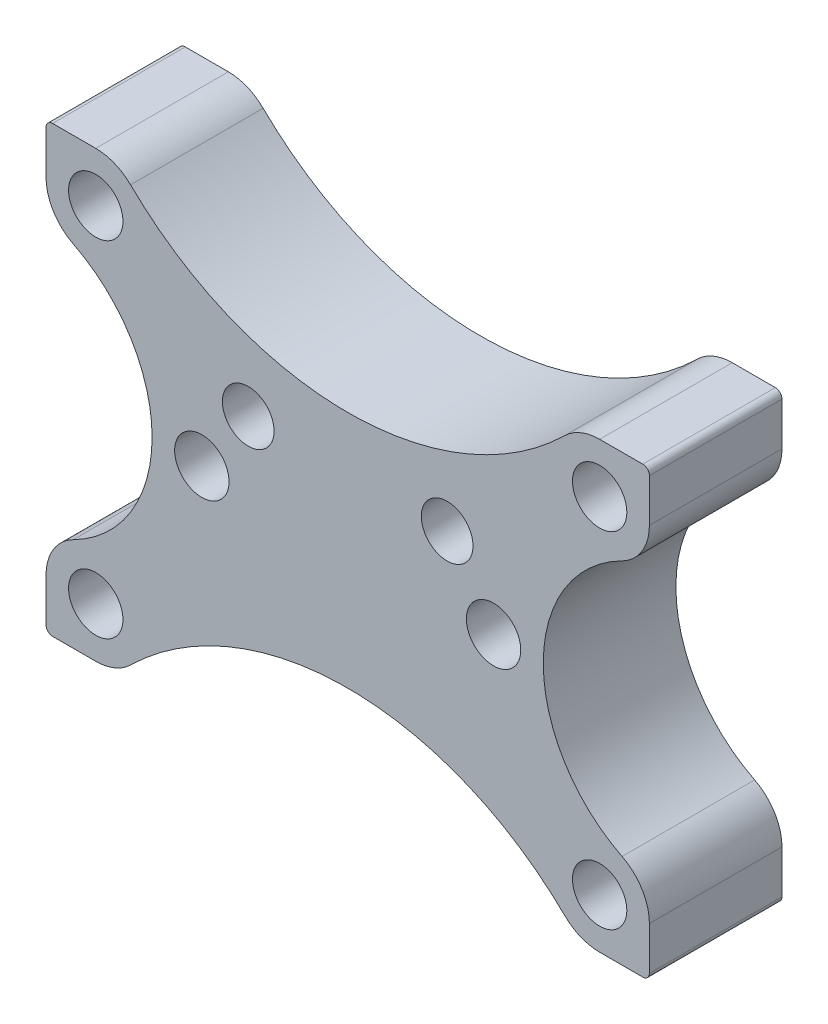
ISO-10303-21;
HEADER;
FILE_DESCRIPTION(('STEP AP214'),'2;1');
FILE_NAME('part.step','',(''),(''),'','','');
FILE_SCHEMA(('AUTOMOTIVE_DESIGN { 1 0 10303 214 1 1 1 1 }'));
ENDSEC;
DATA;
#1=APPLICATION_CONTEXT('core data for automotive mechanical design processes');
#2=APPLICATION_PROTOCOL_DEFINITION('international standard','automotive_design',2000,#1);
#3=PRODUCT_CONTEXT('',#1,'mechanical');
#4=PRODUCT('Part','Part','',(#3));
#5=PRODUCT_RELATED_PRODUCT_CATEGORY('part','',(#4));
#6=PRODUCT_DEFINITION_FORMATION('','',#4);
#7=PRODUCT_DEFINITION_CONTEXT('part definition',#1,'design');
#8=PRODUCT_DEFINITION('design','',#6,#7);
#9=PRODUCT_DEFINITION_SHAPE('','',#8);
#10=(LENGTH_UNIT() NAMED_UNIT(*) SI_UNIT(.MILLI.,.METRE.));
#11=(NAMED_UNIT(*) PLANE_ANGLE_UNIT() SI_UNIT($,.RADIAN.));
#12=(NAMED_UNIT(*) SI_UNIT($,.STERADIAN.) SOLID_ANGLE_UNIT());
#13=UNCERTAINTY_MEASURE_WITH_UNIT(LENGTH_MEASURE(1.E-05),#10,'distance_accuracy_value','');
#14=(GEOMETRIC_REPRESENTATION_CONTEXT(3) GLOBAL_UNCERTAINTY_ASSIGNED_CONTEXT((#13)) GLOBAL_UNIT_ASSIGNED_CONTEXT((#10,
#11,#12)) REPRESENTATION_CONTEXT('',''));
#15=CARTESIAN_POINT('',(0.,0.,0.));
#16=DIRECTION('',(0.,0.,1.));
#17=DIRECTION('',(1.,0.,0.));
#18=AXIS2_PLACEMENT_3D('',#15,#16,#17);
#19=CARTESIAN_POINT('',(-19.0000000000033,13.,10.));
#20=DIRECTION('',(0.,0.,1.));
#21=DIRECTION('',(1.,0.,0.));
#22=AXIS2_PLACEMENT_3D('',#19,#20,#21);
#23=PLANE('',#22);
#24=CARTESIAN_POINT('',(7.5,5.,10.));
#25=DIRECTION('',(0.,0.,1.));
#26=DIRECTION('',(-1.,0.,0.));
#27=AXIS2_PLACEMENT_3D('',#24,#25,#26);
#28=CIRCLE('',#27,1.95);
#29=CARTESIAN_POINT('',(5.55,5.,10.));
#30=VERTEX_POINT('',#29);
#31=EDGE_CURVE('E772',#30,#30,#28,.T.);
#32=ORIENTED_EDGE('',*,*,#31,.F.);
#33=EDGE_LOOP('',(#32));
#34=FACE_BOUND('',#33,.T.);
#35=CARTESIAN_POINT('',(-11.,-1.11195774810113E-12,10.));
#36=DIRECTION('',(0.,0.,1.));
#37=DIRECTION('',(1.,0.,0.));
#38=AXIS2_PLACEMENT_3D('',#35,#36,#37);
#39=CIRCLE('',#38,2.05);
#40=CARTESIAN_POINT('',(-8.95,-1.11195774810113E-12,10.));
#41=VERTEX_POINT('',#40);
#42=EDGE_CURVE('E784',#41,#41,#39,.T.);
#43=ORIENTED_EDGE('',*,*,#42,.F.);
#44=EDGE_LOOP('',(#43));
#45=FACE_BOUND('',#44,.T.);
#46=CARTESIAN_POINT('',(-19.0000000000033,-13.,10.));
#47=DIRECTION('',(0.,0.,1.));
#48=DIRECTION('',(1.,0.,0.));
#49=AXIS2_PLACEMENT_3D('',#46,#47,#48);
#50=CIRCLE('',#49,2.05);
#51=CARTESIAN_POINT('',(-16.9500000000033,-13.,10.));
#52=VERTEX_POINT('',#51);
#53=EDGE_CURVE('E796',#52,#52,#50,.T.);
#54=ORIENTED_EDGE('',*,*,#53,.F.);
#55=EDGE_LOOP('',(#54));
#56=FACE_BOUND('',#55,.T.);
#57=CARTESIAN_POINT('',(18.9999999999967,13.,10.));
#58=DIRECTION('',(0.,0.,1.));
#59=DIRECTION('',(1.,0.,0.));
#60=AXIS2_PLACEMENT_3D('',#57,#58,#59);
#61=CIRCLE('',#60,2.05);
#62=CARTESIAN_POINT('',(21.0499999999967,13.,10.));
#63=VERTEX_POINT('',#62);
#64=EDGE_CURVE('E395',#63,#63,#61,.T.);
#65=ORIENTED_EDGE('',*,*,#64,.F.);
#66=EDGE_LOOP('',(#65));
#67=FACE_BOUND('',#66,.T.);
#68=DIRECTION('',(9.92724421185655E-13,-1.,0.));
#69=VECTOR('',#68,1.);
#70=CARTESIAN_POINT('',(-22.7500000000037,-13.,10.));
#71=LINE('',#70,#69);
#72=CARTESIAN_POINT('',(-22.7500000000028,-13.,10.));
#73=VERTEX_POINT('',#72);
#74=CARTESIAN_POINT('',(-22.7500000000005,-16.2500000000006,10.));
#75=VERTEX_POINT('',#74);
#76=EDGE_CURVE('E409',#73,#75,#71,.T.);
#77=ORIENTED_EDGE('',*,*,#76,.T.);
#78=CARTESIAN_POINT('',(-22.2500000000005,-16.2500000000001,10.));
#79=DIRECTION('',(0.,0.,1.));
#80=DIRECTION('',(1.,0.,0.));
#81=AXIS2_PLACEMENT_3D('',#78,#79,#80);
#82=CIRCLE('',#81,0.5);
#83=CARTESIAN_POINT('',(-22.2500000000005,-16.7500000000001,10.));
#84=VERTEX_POINT('',#83);
#85=EDGE_CURVE('E245',#75,#84,#82,.T.);
#86=ORIENTED_EDGE('',*,*,#85,.T.);
#87=DIRECTION('',(1.,-1.10097116608759E-13,0.));
#88=VECTOR('',#87,1.);
#89=CARTESIAN_POINT('',(-22.75,-16.75,10.));
#90=LINE('',#89,#88);
#91=CARTESIAN_POINT('',(-19.0000000000033,-16.7500000000004,10.));
#92=VERTEX_POINT('',#91);
#93=EDGE_CURVE('E411',#84,#92,#90,.T.);
#94=ORIENTED_EDGE('',*,*,#93,.T.);
#95=CARTESIAN_POINT('',(-19.0000000000033,-13.,10.));
#96=DIRECTION('',(0.,0.,1.));
#97=DIRECTION('',(-1.,0.,0.));
#98=AXIS2_PLACEMENT_3D('',#95,#96,#97);
#99=CIRCLE('',#98,3.75000000000136);
#100=CARTESIAN_POINT('',(-16.3771708475589,-15.6801617930823,10.));
#101=VERTEX_POINT('',#100);
#102=EDGE_CURVE('E413',#92,#101,#99,.T.);
#103=ORIENTED_EDGE('',*,*,#102,.T.);
#104=CARTESIAN_POINT('',(0.,-32.4153225806451,10.));
#105=DIRECTION('',(0.,0.,-1.));
#106=DIRECTION('',(-1.,0.,0.));
#107=AXIS2_PLACEMENT_3D('',#104,#105,#106);
#108=CIRCLE('',#107,23.4153225806451);
#109=CARTESIAN_POINT('',(16.3771708475583,-15.680161793083,10.));
#110=VERTEX_POINT('',#109);
#111=EDGE_CURVE('E377',#101,#110,#108,.T.);
#112=ORIENTED_EDGE('',*,*,#111,.T.);
#113=CARTESIAN_POINT('',(18.9999999999967,-13.,10.));
#114=DIRECTION('',(0.,0.,1.));
#115=DIRECTION('',(-1.,0.,0.));
#116=AXIS2_PLACEMENT_3D('',#113,#114,#115);
#117=CIRCLE('',#116,3.74999999999884);
#118=CARTESIAN_POINT('',(19.,-16.7499999999989,10.));
#119=VERTEX_POINT('',#118);
#120=EDGE_CURVE('E373',#110,#119,#117,.T.);
#121=ORIENTED_EDGE('',*,*,#120,.T.);
#122=DIRECTION('',(1.,0.,0.));
#123=VECTOR('',#122,1.);
#124=CARTESIAN_POINT('',(19.,-16.75,10.));
#125=LINE('',#124,#123);
#126=CARTESIAN_POINT('',(22.2499999999995,-16.75,10.));
#127=VERTEX_POINT('',#126);
#128=EDGE_CURVE('E372',#119,#127,#125,.T.);
#129=ORIENTED_EDGE('',*,*,#128,.T.);
#130=CARTESIAN_POINT('',(22.2499999999995,-16.25,10.));
#131=DIRECTION('',(0.,0.,1.));
#132=DIRECTION('',(1.,0.,0.));
#133=AXIS2_PLACEMENT_3D('',#130,#131,#132);
#134=CIRCLE('',#133,0.5);
#135=CARTESIAN_POINT('',(22.7499999999995,-16.2499999999995,10.));
#136=VERTEX_POINT('',#135);
#137=EDGE_CURVE('E240',#127,#136,#134,.T.);
#138=ORIENTED_EDGE('',*,*,#137,.T.);
#139=DIRECTION('',(-9.90874049477953E-13,1.,0.));
#140=VECTOR('',#139,1.);
#141=CARTESIAN_POINT('',(22.75,-16.75,10.));
#142=LINE('',#141,#140);
#143=CARTESIAN_POINT('',(22.7499999999963,-13.,10.));
#144=VERTEX_POINT('',#143);
#145=EDGE_CURVE('E263',#136,#144,#142,.T.);
#146=ORIENTED_EDGE('',*,*,#145,.T.);
#147=CARTESIAN_POINT('',(18.9999999999967,-13.,10.));
#148=DIRECTION('',(0.,0.,1.));
#149=DIRECTION('',(-1.,0.,0.));
#150=AXIS2_PLACEMENT_3D('',#147,#148,#149);
#151=CIRCLE('',#150,3.75000000000054);
#152=CARTESIAN_POINT('',(20.6899141630897,-9.65236051502232,10.));
#153=VERTEX_POINT('',#152);
#154=EDGE_CURVE('E375',#144,#153,#151,.T.);
#155=ORIENTED_EDGE('',*,*,#154,.T.);
#156=CARTESIAN_POINT('',(25.5625,0.,10.));
#157=DIRECTION('',(0.,0.,-1.));
#158=DIRECTION('',(-1.,0.,0.));
#159=AXIS2_PLACEMENT_3D('',#156,#157,#158);
#160=CIRCLE('',#159,10.8125);
#161=CARTESIAN_POINT('',(20.6899141630901,9.65236051502147,10.));
#162=VERTEX_POINT('',#161);
#163=EDGE_CURVE('E382',#153,#162,#160,.T.);
#164=ORIENTED_EDGE('',*,*,#163,.T.);
#165=CARTESIAN_POINT('',(18.9999999999967,13.,10.));
#166=DIRECTION('',(0.,0.,1.));
#167=DIRECTION('',(1.,0.,0.));
#168=AXIS2_PLACEMENT_3D('',#165,#166,#167);
#169=CIRCLE('',#168,3.75000000000054);
#170=CARTESIAN_POINT('',(22.7499999999972,13.,10.));
#171=VERTEX_POINT('',#170);
#172=EDGE_CURVE('E384',#162,#171,#169,.T.);
#173=ORIENTED_EDGE('',*,*,#172,.T.);
#174=DIRECTION('',(9.899488636241E-13,1.,0.));
#175=VECTOR('',#174,1.);
#176=CARTESIAN_POINT('',(22.75,16.75,10.));
#177=LINE('',#176,#175);
#178=CARTESIAN_POINT('',(22.7499999999995,16.2499999999995,10.));
#179=VERTEX_POINT('',#178);
#180=EDGE_CURVE('E386',#171,#179,#177,.T.);
#181=ORIENTED_EDGE('',*,*,#180,.T.);
#182=CARTESIAN_POINT('',(22.2499999999995,16.25,10.));
#183=DIRECTION('',(0.,0.,1.));
#184=DIRECTION('',(1.,0.,0.));
#185=AXIS2_PLACEMENT_3D('',#182,#183,#184);
#186=CIRCLE('',#185,0.5);
#187=CARTESIAN_POINT('',(22.2499999999994,16.75,10.));
#188=VERTEX_POINT('',#187);
#189=EDGE_CURVE('E47',#179,#188,#186,.T.);
#190=ORIENTED_EDGE('',*,*,#189,.T.);
#191=DIRECTION('',(-1.,-1.08246744900857E-13,0.));
#192=VECTOR('',#191,1.);
#193=CARTESIAN_POINT('',(18.9999999999967,16.7499999999996,10.));
#194=LINE('',#193,#192);
#195=CARTESIAN_POINT('',(18.9999999999967,16.7499999999996,10.));
#196=VERTEX_POINT('',#195);
#197=EDGE_CURVE('E388',#188,#196,#194,.T.);
#198=ORIENTED_EDGE('',*,*,#197,.T.);
#199=CARTESIAN_POINT('',(18.9999999999967,13.,10.));
#200=DIRECTION('',(0.,0.,1.));
#201=DIRECTION('',(1.,0.,0.));
#202=AXIS2_PLACEMENT_3D('',#199,#200,#201);
#203=CIRCLE('',#202,3.74999999999864);
#204=CARTESIAN_POINT('',(16.3771708475576,15.6801617930837,10.));
#205=VERTEX_POINT('',#204);
#206=EDGE_CURVE('E390',#196,#205,#203,.T.);
#207=ORIENTED_EDGE('',*,*,#206,.T.);
#208=CARTESIAN_POINT('',(0.,32.4153225806451,10.));
#209=DIRECTION('',(0.,0.,-1.));
#210=DIRECTION('',(-1.,0.,0.));
#211=AXIS2_PLACEMENT_3D('',#208,#209,#210);
#212=CIRCLE('',#211,23.4153225806451);
#213=CARTESIAN_POINT('',(-16.3771708475583,15.680161793083,10.));
#214=VERTEX_POINT('',#213);
#215=EDGE_CURVE('E211',#205,#214,#212,.T.);
#216=ORIENTED_EDGE('',*,*,#215,.T.);
#217=CARTESIAN_POINT('',(-19.0000000000033,13.,10.));
#218=DIRECTION('',(0.,0.,1.));
#219=DIRECTION('',(1.,0.,0.));
#220=AXIS2_PLACEMENT_3D('',#217,#218,#219);
#221=CIRCLE('',#220,3.75000000000136);
#222=CARTESIAN_POINT('',(-19.0000000000033,16.7500000000004,10.));
#223=VERTEX_POINT('',#222);
#224=EDGE_CURVE('E205',#214,#223,#221,.T.);
#225=ORIENTED_EDGE('',*,*,#224,.T.);
#226=DIRECTION('',(-1.,-1.12872674170324E-13,0.));
#227=VECTOR('',#226,1.);
#228=CARTESIAN_POINT('',(-19.0000000000033,16.7500000000004,10.));
#229=LINE('',#228,#227);
#230=CARTESIAN_POINT('',(-22.2500000000005,16.7500000000001,10.));
#231=VERTEX_POINT('',#230);
#232=EDGE_CURVE('E194',#223,#231,#229,.T.);
#233=ORIENTED_EDGE('',*,*,#232,.T.);
#234=CARTESIAN_POINT('',(-22.2500000000005,16.2500000000001,10.));
#235=DIRECTION('',(0.,0.,1.));
#236=DIRECTION('',(1.,0.,0.));
#237=AXIS2_PLACEMENT_3D('',#234,#235,#236);
#238=CIRCLE('',#237,0.5);
#239=CARTESIAN_POINT('',(-22.7500000000005,16.2500000000005,10.));
#240=VERTEX_POINT('',#239);
#241=EDGE_CURVE('E243',#231,#240,#238,.T.);
#242=ORIENTED_EDGE('',*,*,#241,.T.);
#243=DIRECTION('',(-9.92724421185658E-13,-1.,0.));
#244=VECTOR('',#243,1.);
#245=CARTESIAN_POINT('',(-22.75,16.75,10.));
#246=LINE('',#245,#244);
#247=CARTESIAN_POINT('',(-22.7500000000037,13.,10.));
#248=VERTEX_POINT('',#247);
#249=EDGE_CURVE('E204',#240,#248,#246,.T.);
#250=ORIENTED_EDGE('',*,*,#249,.T.);
#251=CARTESIAN_POINT('',(-19.0000000000033,13.,10.));
#252=DIRECTION('',(0.,0.,1.));
#253=DIRECTION('',(1.,0.,0.));
#254=AXIS2_PLACEMENT_3D('',#251,#252,#253);
#255=CIRCLE('',#254,3.74999999999946);
#256=CARTESIAN_POINT('',(-20.6899141630906,9.65236051502062,10.));
#257=VERTEX_POINT('',#256);
#258=EDGE_CURVE('E402',#248,#257,#255,.T.);
#259=ORIENTED_EDGE('',*,*,#258,.T.);
#260=CARTESIAN_POINT('',(-25.5625,0.,10.));
#261=DIRECTION('',(0.,0.,-1.));
#262=DIRECTION('',(-1.,0.,0.));
#263=AXIS2_PLACEMENT_3D('',#260,#261,#262);
#264=CIRCLE('',#263,10.8125);
#265=CARTESIAN_POINT('',(-20.6899141630901,-9.65236051502147,10.));
#266=VERTEX_POINT('',#265);
#267=EDGE_CURVE('E337',#257,#266,#264,.T.);
#268=ORIENTED_EDGE('',*,*,#267,.T.);
#269=CARTESIAN_POINT('',(-19.0000000000033,-13.,10.));
#270=DIRECTION('',(0.,0.,1.));
#271=DIRECTION('',(-1.,0.,0.));
#272=AXIS2_PLACEMENT_3D('',#269,#270,#271);
#273=CIRCLE('',#272,3.74999999999946);
#274=EDGE_CURVE('E404',#266,#73,#273,.T.);
#275=ORIENTED_EDGE('',*,*,#274,.T.);
#276=EDGE_LOOP('',(#77,#86,#94,#103,#112,#121,#129,#138,#146,#155,#164,#173,#181,#190,#198,#207,
#216,#225,#233,#242,#250,#259,#268,#275));
#277=FACE_BOUND('',#276,.T.);
#278=CARTESIAN_POINT('',(-19.0000000000033,13.,10.));
#279=DIRECTION('',(0.,0.,1.));
#280=DIRECTION('',(1.,0.,0.));
#281=AXIS2_PLACEMENT_3D('',#278,#279,#280);
#282=CIRCLE('',#281,2.05);
#283=CARTESIAN_POINT('',(-16.9500000000033,13.,10.));
#284=VERTEX_POINT('',#283);
#285=EDGE_CURVE('E802',#284,#284,#282,.T.);
#286=ORIENTED_EDGE('',*,*,#285,.F.);
#287=EDGE_LOOP('',(#286));
#288=FACE_BOUND('',#287,.T.);
#289=CARTESIAN_POINT('',(18.9999999999967,-13.,10.));
#290=DIRECTION('',(0.,0.,1.));
#291=DIRECTION('',(1.,0.,0.));
#292=AXIS2_PLACEMENT_3D('',#289,#290,#291);
#293=CIRCLE('',#292,2.05);
#294=CARTESIAN_POINT('',(21.0499999999967,-13.,10.));
#295=VERTEX_POINT('',#294);
#296=EDGE_CURVE('E790',#295,#295,#293,.T.);
#297=ORIENTED_EDGE('',*,*,#296,.F.);
#298=EDGE_LOOP('',(#297));
#299=FACE_BOUND('',#298,.T.);
#300=CARTESIAN_POINT('',(11.,-1.11022302462516E-12,10.));
#301=DIRECTION('',(0.,0.,1.));
#302=DIRECTION('',(1.,0.,0.));
#303=AXIS2_PLACEMENT_3D('',#300,#301,#302);
#304=CIRCLE('',#303,2.05);
#305=CARTESIAN_POINT('',(13.05,-1.11022302462516E-12,10.));
#306=VERTEX_POINT('',#305);
#307=EDGE_CURVE('E778',#306,#306,#304,.T.);
#308=ORIENTED_EDGE('',*,*,#307,.F.);
#309=EDGE_LOOP('',(#308));
#310=FACE_BOUND('',#309,.T.);
#311=CARTESIAN_POINT('',(-7.5,5.,10.));
#312=DIRECTION('',(0.,0.,1.));
#313=DIRECTION('',(-1.,0.,0.));
#314=AXIS2_PLACEMENT_3D('',#311,#312,#313);
#315=CIRCLE('',#314,1.95);
#316=CARTESIAN_POINT('',(-9.45,5.,10.));
#317=VERTEX_POINT('',#316);
#318=EDGE_CURVE('E763',#317,#317,#315,.T.);
#319=ORIENTED_EDGE('',*,*,#318,.F.);
#320=EDGE_LOOP('',(#319));
#321=FACE_BOUND('',#320,.T.);
#322=ADVANCED_FACE('F32',(#34,#45,#56,#67,#277,#288,#299,#310,#321),#23,.T.);
#323=CARTESIAN_POINT('',(-19.0000000000033,13.,0.));
#324=DIRECTION('',(0.,0.,1.));
#325=DIRECTION('',(1.,0.,0.));
#326=AXIS2_PLACEMENT_3D('',#323,#324,#325);
#327=PLANE('',#326);
#328=CARTESIAN_POINT('',(7.5,5.,0.));
#329=DIRECTION('',(0.,0.,1.));
#330=DIRECTION('',(-1.,0.,0.));
#331=AXIS2_PLACEMENT_3D('',#328,#329,#330);
#332=CIRCLE('',#331,1.95);
#333=CARTESIAN_POINT('',(5.55,5.,0.));
#334=VERTEX_POINT('',#333);
#335=EDGE_CURVE('E769',#334,#334,#332,.T.);
#336=ORIENTED_EDGE('',*,*,#335,.T.);
#337=EDGE_LOOP('',(#336));
#338=FACE_BOUND('',#337,.T.);
#339=CARTESIAN_POINT('',(-11.,-1.11195774810113E-12,0.));
#340=DIRECTION('',(0.,0.,1.));
#341=DIRECTION('',(1.,0.,0.));
#342=AXIS2_PLACEMENT_3D('',#339,#340,#341);
#343=CIRCLE('',#342,2.05);
#344=CARTESIAN_POINT('',(-8.95,-1.11195774810113E-12,0.));
#345=VERTEX_POINT('',#344);
#346=EDGE_CURVE('E781',#345,#345,#343,.T.);
#347=ORIENTED_EDGE('',*,*,#346,.T.);
#348=EDGE_LOOP('',(#347));
#349=FACE_BOUND('',#348,.T.);
#350=CARTESIAN_POINT('',(-19.0000000000033,-13.,0.));
#351=DIRECTION('',(0.,0.,1.));
#352=DIRECTION('',(1.,0.,0.));
#353=AXIS2_PLACEMENT_3D('',#350,#351,#352);
#354=CIRCLE('',#353,2.05);
#355=CARTESIAN_POINT('',(-16.9500000000033,-13.,0.));
#356=VERTEX_POINT('',#355);
#357=EDGE_CURVE('E793',#356,#356,#354,.T.);
#358=ORIENTED_EDGE('',*,*,#357,.T.);
#359=EDGE_LOOP('',(#358));
#360=FACE_BOUND('',#359,.T.);
#361=CARTESIAN_POINT('',(18.9999999999967,13.,0.));
#362=DIRECTION('',(0.,0.,1.));
#363=DIRECTION('',(1.,0.,0.));
#364=AXIS2_PLACEMENT_3D('',#361,#362,#363);
#365=CIRCLE('',#364,2.05);
#366=CARTESIAN_POINT('',(21.0499999999967,13.,0.));
#367=VERTEX_POINT('',#366);
#368=EDGE_CURVE('E805',#367,#367,#365,.T.);
#369=ORIENTED_EDGE('',*,*,#368,.T.);
#370=EDGE_LOOP('',(#369));
#371=FACE_BOUND('',#370,.T.);
#372=DIRECTION('',(1.,-1.10097116608759E-13,0.));
#373=VECTOR('',#372,1.);
#374=CARTESIAN_POINT('',(-22.75,-16.75,0.));
#375=LINE('',#374,#373);
#376=CARTESIAN_POINT('',(-22.2500000000005,-16.7500000000001,0.));
#377=VERTEX_POINT('',#376);
#378=CARTESIAN_POINT('',(-19.0000000000033,-16.7500000000004,0.));
#379=VERTEX_POINT('',#378);
#380=EDGE_CURVE('E355',#377,#379,#375,.T.);
#381=ORIENTED_EDGE('',*,*,#380,.F.);
#382=CARTESIAN_POINT('',(-22.2500000000005,-16.2500000000001,0.));
#383=DIRECTION('',(0.,0.,1.));
#384=DIRECTION('',(1.,0.,0.));
#385=AXIS2_PLACEMENT_3D('',#382,#383,#384);
#386=CIRCLE('',#385,0.5);
#387=CARTESIAN_POINT('',(-22.7500000000005,-16.2500000000006,0.));
#388=VERTEX_POINT('',#387);
#389=EDGE_CURVE('E236',#377,#388,#386,.F.);
#390=ORIENTED_EDGE('',*,*,#389,.T.);
#391=DIRECTION('',(9.92724421185655E-13,-1.,0.));
#392=VECTOR('',#391,1.);
#393=CARTESIAN_POINT('',(-22.7500000000037,-13.,0.));
#394=LINE('',#393,#392);
#395=CARTESIAN_POINT('',(-22.7500000000028,-13.,0.));
#396=VERTEX_POINT('',#395);
#397=EDGE_CURVE('E347',#396,#388,#394,.T.);
#398=ORIENTED_EDGE('',*,*,#397,.F.);
#399=CARTESIAN_POINT('',(-19.0000000000033,-13.,0.));
#400=DIRECTION('',(0.,0.,1.));
#401=DIRECTION('',(-1.,0.,0.));
#402=AXIS2_PLACEMENT_3D('',#399,#400,#401);
#403=CIRCLE('',#402,3.74999999999946);
#404=CARTESIAN_POINT('',(-20.6899141630901,-9.65236051502147,0.));
#405=VERTEX_POINT('',#404);
#406=EDGE_CURVE('E345',#405,#396,#403,.T.);
#407=ORIENTED_EDGE('',*,*,#406,.F.);
#408=CARTESIAN_POINT('',(-25.5625,0.,0.));
#409=DIRECTION('',(0.,0.,-1.));
#410=DIRECTION('',(-1.,0.,0.));
#411=AXIS2_PLACEMENT_3D('',#408,#409,#410);
#412=CIRCLE('',#411,10.8125);
#413=CARTESIAN_POINT('',(-20.6899141630906,9.65236051502062,0.));
#414=VERTEX_POINT('',#413);
#415=EDGE_CURVE('E336',#414,#405,#412,.T.);
#416=ORIENTED_EDGE('',*,*,#415,.F.);
#417=CARTESIAN_POINT('',(-19.0000000000033,13.,0.));
#418=DIRECTION('',(0.,0.,1.));
#419=DIRECTION('',(1.,0.,0.));
#420=AXIS2_PLACEMENT_3D('',#417,#418,#419);
#421=CIRCLE('',#420,3.74999999999946);
#422=CARTESIAN_POINT('',(-22.7500000000037,13.,0.));
#423=VERTEX_POINT('',#422);
#424=EDGE_CURVE('E343',#423,#414,#421,.T.);
#425=ORIENTED_EDGE('',*,*,#424,.F.);
#426=DIRECTION('',(-9.92724421185658E-13,-1.,0.));
#427=VECTOR('',#426,1.);
#428=CARTESIAN_POINT('',(-22.75,16.75,0.));
#429=LINE('',#428,#427);
#430=CARTESIAN_POINT('',(-22.7500000000005,16.2500000000005,0.));
#431=VERTEX_POINT('',#430);
#432=EDGE_CURVE('E349',#431,#423,#429,.T.);
#433=ORIENTED_EDGE('',*,*,#432,.F.);
#434=CARTESIAN_POINT('',(-22.2500000000005,16.2500000000001,0.));
#435=DIRECTION('',(0.,0.,1.));
#436=DIRECTION('',(1.,0.,0.));
#437=AXIS2_PLACEMENT_3D('',#434,#435,#436);
#438=CIRCLE('',#437,0.5);
#439=CARTESIAN_POINT('',(-22.2500000000005,16.7500000000001,0.));
#440=VERTEX_POINT('',#439);
#441=EDGE_CURVE('E234',#431,#440,#438,.F.);
#442=ORIENTED_EDGE('',*,*,#441,.T.);
#443=DIRECTION('',(-1.,-1.12872674170324E-13,0.));
#444=VECTOR('',#443,1.);
#445=CARTESIAN_POINT('',(-19.0000000000033,16.7500000000004,0.));
#446=LINE('',#445,#444);
#447=CARTESIAN_POINT('',(-19.0000000000033,16.7500000000004,0.));
#448=VERTEX_POINT('',#447);
#449=EDGE_CURVE('E394',#448,#440,#446,.T.);
#450=ORIENTED_EDGE('',*,*,#449,.F.);
#451=CARTESIAN_POINT('',(-19.0000000000033,13.,0.));
#452=DIRECTION('',(0.,0.,1.));
#453=DIRECTION('',(1.,0.,0.));
#454=AXIS2_PLACEMENT_3D('',#451,#452,#453);
#455=CIRCLE('',#454,3.75000000000136);
#456=CARTESIAN_POINT('',(-16.3771708475583,15.680161793083,0.));
#457=VERTEX_POINT('',#456);
#458=EDGE_CURVE('E219',#457,#448,#455,.T.);
#459=ORIENTED_EDGE('',*,*,#458,.F.);
#460=CARTESIAN_POINT('',(0.,32.4153225806451,0.));
#461=DIRECTION('',(0.,0.,-1.));
#462=DIRECTION('',(-1.,0.,0.));
#463=AXIS2_PLACEMENT_3D('',#460,#461,#462);
#464=CIRCLE('',#463,23.4153225806451);
#465=CARTESIAN_POINT('',(16.3771708475576,15.6801617930837,0.));
#466=VERTEX_POINT('',#465);
#467=EDGE_CURVE('E215',#466,#457,#464,.T.);
#468=ORIENTED_EDGE('',*,*,#467,.F.);
#469=CARTESIAN_POINT('',(18.9999999999967,13.,0.));
#470=DIRECTION('',(0.,0.,1.));
#471=DIRECTION('',(1.,0.,0.));
#472=AXIS2_PLACEMENT_3D('',#469,#470,#471);
#473=CIRCLE('',#472,3.74999999999864);
#474=CARTESIAN_POINT('',(18.9999999999967,16.7499999999996,0.));
#475=VERTEX_POINT('',#474);
#476=EDGE_CURVE('E290',#475,#466,#473,.T.);
#477=ORIENTED_EDGE('',*,*,#476,.F.);
#478=DIRECTION('',(-1.,-1.08246744900857E-13,0.));
#479=VECTOR('',#478,1.);
#480=CARTESIAN_POINT('',(18.9999999999967,16.7499999999996,0.));
#481=LINE('',#480,#479);
#482=CARTESIAN_POINT('',(22.2499999999994,16.75,0.));
#483=VERTEX_POINT('',#482);
#484=EDGE_CURVE('E288',#483,#475,#481,.T.);
#485=ORIENTED_EDGE('',*,*,#484,.F.);
#486=CARTESIAN_POINT('',(22.2499999999995,16.25,0.));
#487=DIRECTION('',(0.,0.,1.));
#488=DIRECTION('',(1.,0.,0.));
#489=AXIS2_PLACEMENT_3D('',#486,#487,#488);
#490=CIRCLE('',#489,0.5);
#491=CARTESIAN_POINT('',(22.7499999999995,16.2499999999995,0.));
#492=VERTEX_POINT('',#491);
#493=EDGE_CURVE('E232',#483,#492,#490,.F.);
#494=ORIENTED_EDGE('',*,*,#493,.T.);
#495=DIRECTION('',(9.899488636241E-13,1.,0.));
#496=VECTOR('',#495,1.);
#497=CARTESIAN_POINT('',(22.75,16.75,0.));
#498=LINE('',#497,#496);
#499=CARTESIAN_POINT('',(22.7499999999972,13.,0.));
#500=VERTEX_POINT('',#499);
#501=EDGE_CURVE('E286',#500,#492,#498,.T.);
#502=ORIENTED_EDGE('',*,*,#501,.F.);
#503=CARTESIAN_POINT('',(18.9999999999967,13.,0.));
#504=DIRECTION('',(0.,0.,1.));
#505=DIRECTION('',(1.,0.,0.));
#506=AXIS2_PLACEMENT_3D('',#503,#504,#505);
#507=CIRCLE('',#506,3.75000000000054);
#508=CARTESIAN_POINT('',(20.6899141630901,9.65236051502147,0.));
#509=VERTEX_POINT('',#508);
#510=EDGE_CURVE('E284',#509,#500,#507,.T.);
#511=ORIENTED_EDGE('',*,*,#510,.F.);
#512=CARTESIAN_POINT('',(25.5625,0.,0.));
#513=DIRECTION('',(0.,0.,-1.));
#514=DIRECTION('',(-1.,0.,0.));
#515=AXIS2_PLACEMENT_3D('',#512,#513,#514);
#516=CIRCLE('',#515,10.8125);
#517=CARTESIAN_POINT('',(20.6899141630897,-9.65236051502232,0.));
#518=VERTEX_POINT('',#517);
#519=EDGE_CURVE('E277',#518,#509,#516,.T.);
#520=ORIENTED_EDGE('',*,*,#519,.F.);
#521=CARTESIAN_POINT('',(18.9999999999967,-13.,0.));
#522=DIRECTION('',(0.,0.,1.));
#523=DIRECTION('',(-1.,0.,0.));
#524=AXIS2_PLACEMENT_3D('',#521,#522,#523);
#525=CIRCLE('',#524,3.75000000000054);
#526=CARTESIAN_POINT('',(22.7499999999963,-13.,0.));
#527=VERTEX_POINT('',#526);
#528=EDGE_CURVE('E274',#527,#518,#525,.T.);
#529=ORIENTED_EDGE('',*,*,#528,.F.);
#530=DIRECTION('',(-9.90874049477953E-13,1.,0.));
#531=VECTOR('',#530,1.);
#532=CARTESIAN_POINT('',(22.75,-16.75,0.));
#533=LINE('',#532,#531);
#534=CARTESIAN_POINT('',(22.7499999999995,-16.2499999999995,0.));
#535=VERTEX_POINT('',#534);
#536=EDGE_CURVE('E261',#535,#527,#533,.T.);
#537=ORIENTED_EDGE('',*,*,#536,.F.);
#538=CARTESIAN_POINT('',(22.2499999999995,-16.25,0.));
#539=DIRECTION('',(0.,0.,1.));
#540=DIRECTION('',(1.,0.,0.));
#541=AXIS2_PLACEMENT_3D('',#538,#539,#540);
#542=CIRCLE('',#541,0.5);
#543=CARTESIAN_POINT('',(22.2499999999995,-16.75,0.));
#544=VERTEX_POINT('',#543);
#545=EDGE_CURVE('E224',#535,#544,#542,.F.);
#546=ORIENTED_EDGE('',*,*,#545,.T.);
#547=DIRECTION('',(1.,0.,0.));
#548=VECTOR('',#547,1.);
#549=CARTESIAN_POINT('',(19.,-16.75,0.));
#550=LINE('',#549,#548);
#551=CARTESIAN_POINT('',(19.,-16.7499999999989,0.));
#552=VERTEX_POINT('',#551);
#553=EDGE_CURVE('E275',#552,#544,#550,.T.);
#554=ORIENTED_EDGE('',*,*,#553,.F.);
#555=CARTESIAN_POINT('',(18.9999999999967,-13.,0.));
#556=DIRECTION('',(0.,0.,1.));
#557=DIRECTION('',(-1.,0.,0.));
#558=AXIS2_PLACEMENT_3D('',#555,#556,#557);
#559=CIRCLE('',#558,3.74999999999884);
#560=CARTESIAN_POINT('',(16.3771708475583,-15.680161793083,0.));
#561=VERTEX_POINT('',#560);
#562=EDGE_CURVE('E279',#561,#552,#559,.T.);
#563=ORIENTED_EDGE('',*,*,#562,.F.);
#564=CARTESIAN_POINT('',(0.,-32.4153225806451,0.));
#565=DIRECTION('',(0.,0.,-1.));
#566=DIRECTION('',(-1.,0.,0.));
#567=AXIS2_PLACEMENT_3D('',#564,#565,#566);
#568=CIRCLE('',#567,23.4153225806451);
#569=CARTESIAN_POINT('',(-16.3771708475589,-15.6801617930823,0.));
#570=VERTEX_POINT('',#569);
#571=EDGE_CURVE('E359',#570,#561,#568,.T.);
#572=ORIENTED_EDGE('',*,*,#571,.F.);
#573=CARTESIAN_POINT('',(-19.0000000000033,-13.,0.));
#574=DIRECTION('',(0.,0.,1.));
#575=DIRECTION('',(-1.,0.,0.));
#576=AXIS2_PLACEMENT_3D('',#573,#574,#575);
#577=CIRCLE('',#576,3.75000000000136);
#578=EDGE_CURVE('E357',#379,#570,#577,.T.);
#579=ORIENTED_EDGE('',*,*,#578,.F.);
#580=EDGE_LOOP('',(#381,#390,#398,#407,#416,#425,#433,#442,#450,#459,#468,#477,#485,#494,#502,
#511,#520,#529,#537,#546,#554,#563,#572,#579));
#581=FACE_BOUND('',#580,.T.);
#582=CARTESIAN_POINT('',(-19.0000000000033,13.,0.));
#583=DIRECTION('',(0.,0.,1.));
#584=DIRECTION('',(1.,0.,0.));
#585=AXIS2_PLACEMENT_3D('',#582,#583,#584);
#586=CIRCLE('',#585,2.05);
#587=CARTESIAN_POINT('',(-16.9500000000033,13.,0.));
#588=VERTEX_POINT('',#587);
#589=EDGE_CURVE('E799',#588,#588,#586,.T.);
#590=ORIENTED_EDGE('',*,*,#589,.T.);
#591=EDGE_LOOP('',(#590));
#592=FACE_BOUND('',#591,.T.);
#593=CARTESIAN_POINT('',(18.9999999999967,-13.,0.));
#594=DIRECTION('',(0.,0.,1.));
#595=DIRECTION('',(1.,0.,0.));
#596=AXIS2_PLACEMENT_3D('',#593,#594,#595);
#597=CIRCLE('',#596,2.05);
#598=CARTESIAN_POINT('',(21.0499999999967,-13.,0.));
#599=VERTEX_POINT('',#598);
#600=EDGE_CURVE('E787',#599,#599,#597,.T.);
#601=ORIENTED_EDGE('',*,*,#600,.T.);
#602=EDGE_LOOP('',(#601));
#603=FACE_BOUND('',#602,.T.);
#604=CARTESIAN_POINT('',(11.,-1.11022302462516E-12,0.));
#605=DIRECTION('',(0.,0.,1.));
#606=DIRECTION('',(1.,0.,0.));
#607=AXIS2_PLACEMENT_3D('',#604,#605,#606);
#608=CIRCLE('',#607,2.05);
#609=CARTESIAN_POINT('',(13.05,-1.11022302462516E-12,0.));
#610=VERTEX_POINT('',#609);
#611=EDGE_CURVE('E775',#610,#610,#608,.T.);
#612=ORIENTED_EDGE('',*,*,#611,.T.);
#613=EDGE_LOOP('',(#612));
#614=FACE_BOUND('',#613,.T.);
#615=CARTESIAN_POINT('',(-7.5,5.,0.));
#616=DIRECTION('',(0.,0.,1.));
#617=DIRECTION('',(-1.,0.,0.));
#618=AXIS2_PLACEMENT_3D('',#615,#616,#617);
#619=CIRCLE('',#618,1.95);
#620=CARTESIAN_POINT('',(-9.45,5.,0.));
#621=VERTEX_POINT('',#620);
#622=EDGE_CURVE('E766',#621,#621,#619,.T.);
#623=ORIENTED_EDGE('',*,*,#622,.T.);
#624=EDGE_LOOP('',(#623));
#625=FACE_BOUND('',#624,.T.);
#626=ADVANCED_FACE('F269',(#338,#349,#360,#371,#581,#592,#603,#614,#625),#327,.F.);
#627=CARTESIAN_POINT('',(-19.0000000000033,13.,10.));
#628=DIRECTION('',(0.,0.,-1.));
#629=DIRECTION('',(-1.,0.,0.));
#630=AXIS2_PLACEMENT_3D('',#627,#628,#629);
#631=CYLINDRICAL_SURFACE('',#630,3.75000000000136);
#632=ORIENTED_EDGE('',*,*,#458,.T.);
#633=DIRECTION('',(0.,0.,-1.));
#634=VECTOR('',#633,1.);
#635=CARTESIAN_POINT('',(-19.0000000000033,16.7500000000004,10.));
#636=LINE('',#635,#634);
#637=EDGE_CURVE('E199',#223,#448,#636,.T.);
#638=ORIENTED_EDGE('',*,*,#637,.F.);
#639=ORIENTED_EDGE('',*,*,#224,.F.);
#640=DIRECTION('',(0.,0.,-1.));
#641=VECTOR('',#640,1.);
#642=CARTESIAN_POINT('',(-16.3771708475583,15.680161793083,10.));
#643=LINE('',#642,#641);
#644=EDGE_CURVE('E293',#214,#457,#643,.T.);
#645=ORIENTED_EDGE('',*,*,#644,.T.);
#646=EDGE_LOOP('',(#632,#638,#639,#645));
#647=FACE_BOUND('',#646,.T.);
#648=ADVANCED_FACE('F217',(#647),#631,.T.);
#649=CARTESIAN_POINT('',(-19.0000000000033,16.7500000000004,10.));
#650=DIRECTION('',(1.12872674170324E-13,-1.,0.));
#651=DIRECTION('',(1.,1.12872674170324E-13,0.));
#652=AXIS2_PLACEMENT_3D('',#649,#650,#651);
#653=PLANE('',#652);
#654=ORIENTED_EDGE('',*,*,#449,.T.);
#655=DIRECTION('',(0.,0.,-1.));
#656=VECTOR('',#655,1.);
#657=CARTESIAN_POINT('',(-22.2500000000005,16.7500000000001,10.));
#658=LINE('',#657,#656);
#659=EDGE_CURVE('E202',#440,#231,#658,.F.);
#660=ORIENTED_EDGE('',*,*,#659,.T.);
#661=ORIENTED_EDGE('',*,*,#232,.F.);
#662=ORIENTED_EDGE('',*,*,#637,.T.);
#663=EDGE_LOOP('',(#654,#660,#661,#662));
#664=FACE_BOUND('',#663,.T.);
#665=ADVANCED_FACE('F197',(#664),#653,.F.);
#666=CARTESIAN_POINT('',(-22.75,16.75,10.));
#667=DIRECTION('',(1.,-9.92724421185658E-13,0.));
#668=DIRECTION('',(9.92724421185658E-13,1.,0.));
#669=AXIS2_PLACEMENT_3D('',#666,#667,#668);
#670=PLANE('',#669);
#671=ORIENTED_EDGE('',*,*,#249,.F.);
#672=DIRECTION('',(0.,0.,-1.));
#673=VECTOR('',#672,1.);
#674=CARTESIAN_POINT('',(-22.7500000000005,16.2500000000005,10.));
#675=LINE('',#674,#673);
#676=EDGE_CURVE('E247',#240,#431,#675,.T.);
#677=ORIENTED_EDGE('',*,*,#676,.T.);
#678=ORIENTED_EDGE('',*,*,#432,.T.);
#679=DIRECTION('',(0.,0.,-1.));
#680=VECTOR('',#679,1.);
#681=CARTESIAN_POINT('',(-22.7500000000037,13.,10.));
#682=LINE('',#681,#680);
#683=EDGE_CURVE('E221',#248,#423,#682,.T.);
#684=ORIENTED_EDGE('',*,*,#683,.F.);
#685=EDGE_LOOP('',(#671,#677,#678,#684));
#686=FACE_BOUND('',#685,.T.);
#687=ADVANCED_FACE('F399',(#686),#670,.F.);
#688=CARTESIAN_POINT('',(-19.0000000000033,13.,10.));
#689=DIRECTION('',(0.,0.,-1.));
#690=DIRECTION('',(-1.,0.,0.));
#691=AXIS2_PLACEMENT_3D('',#688,#689,#690);
#692=CYLINDRICAL_SURFACE('',#691,3.74999999999946);
#693=ORIENTED_EDGE('',*,*,#424,.T.);
#694=DIRECTION('',(0.,0.,-1.));
#695=VECTOR('',#694,1.);
#696=CARTESIAN_POINT('',(-20.6899141630906,9.65236051502062,10.));
#697=LINE('',#696,#695);
#698=EDGE_CURVE('E227',#257,#414,#697,.T.);
#699=ORIENTED_EDGE('',*,*,#698,.F.);
#700=ORIENTED_EDGE('',*,*,#258,.F.);
#701=ORIENTED_EDGE('',*,*,#683,.T.);
#702=EDGE_LOOP('',(#693,#699,#700,#701));
#703=FACE_BOUND('',#702,.T.);
#704=ADVANCED_FACE('F401',(#703),#692,.T.);
#705=CARTESIAN_POINT('',(-25.5625,0.,10.));
#706=DIRECTION('',(0.,0.,-1.));
#707=DIRECTION('',(-1.,0.,0.));
#708=AXIS2_PLACEMENT_3D('',#705,#706,#707);
#709=CYLINDRICAL_SURFACE('',#708,10.8125);
#710=ORIENTED_EDGE('',*,*,#415,.T.);
#711=DIRECTION('',(0.,0.,-1.));
#712=VECTOR('',#711,1.);
#713=CARTESIAN_POINT('',(-20.6899141630901,-9.65236051502147,10.));
#714=LINE('',#713,#712);
#715=EDGE_CURVE('E327',#266,#405,#714,.T.);
#716=ORIENTED_EDGE('',*,*,#715,.F.);
#717=ORIENTED_EDGE('',*,*,#267,.F.);
#718=ORIENTED_EDGE('',*,*,#698,.T.);
#719=EDGE_LOOP('',(#710,#716,#717,#718));
#720=FACE_BOUND('',#719,.T.);
#721=ADVANCED_FACE('F334',(#720),#709,.F.);
#722=CARTESIAN_POINT('',(-19.0000000000033,-13.,10.));
#723=DIRECTION('',(0.,0.,-1.));
#724=DIRECTION('',(-1.,0.,0.));
#725=AXIS2_PLACEMENT_3D('',#722,#723,#724);
#726=CYLINDRICAL_SURFACE('',#725,3.74999999999946);
#727=ORIENTED_EDGE('',*,*,#406,.T.);
#728=DIRECTION('',(0.,0.,-1.));
#729=VECTOR('',#728,1.);
#730=CARTESIAN_POINT('',(-22.7500000000028,-13.,10.));
#731=LINE('',#730,#729);
#732=EDGE_CURVE('E324',#73,#396,#731,.T.);
#733=ORIENTED_EDGE('',*,*,#732,.F.);
#734=ORIENTED_EDGE('',*,*,#274,.F.);
#735=ORIENTED_EDGE('',*,*,#715,.T.);
#736=EDGE_LOOP('',(#727,#733,#734,#735));
#737=FACE_BOUND('',#736,.T.);
#738=ADVANCED_FACE('F437',(#737),#726,.T.);
#739=CARTESIAN_POINT('',(-22.7500000000037,-13.,10.));
#740=DIRECTION('',(1.,9.92724421185655E-13,0.));
#741=DIRECTION('',(-9.92724421185655E-13,1.,0.));
#742=AXIS2_PLACEMENT_3D('',#739,#740,#741);
#743=PLANE('',#742);
#744=ORIENTED_EDGE('',*,*,#397,.T.);
#745=DIRECTION('',(0.,0.,-1.));
#746=VECTOR('',#745,1.);
#747=CARTESIAN_POINT('',(-22.7500000000005,-16.2500000000006,10.));
#748=LINE('',#747,#746);
#749=EDGE_CURVE('E238',#388,#75,#748,.F.);
#750=ORIENTED_EDGE('',*,*,#749,.T.);
#751=ORIENTED_EDGE('',*,*,#76,.F.);
#752=ORIENTED_EDGE('',*,*,#732,.T.);
#753=EDGE_LOOP('',(#744,#750,#751,#752));
#754=FACE_BOUND('',#753,.T.);
#755=ADVANCED_FACE('F432',(#754),#743,.F.);
#756=CARTESIAN_POINT('',(-22.75,-16.75,10.));
#757=DIRECTION('',(1.10097116608759E-13,1.,0.));
#758=DIRECTION('',(-1.,1.10097116608759E-13,0.));
#759=AXIS2_PLACEMENT_3D('',#756,#757,#758);
#760=PLANE('',#759);
#761=ORIENTED_EDGE('',*,*,#93,.F.);
#762=DIRECTION('',(0.,0.,-1.));
#763=VECTOR('',#762,1.);
#764=CARTESIAN_POINT('',(-22.2500000000005,-16.7500000000001,10.));
#765=LINE('',#764,#763);
#766=EDGE_CURVE('E220',#84,#377,#765,.T.);
#767=ORIENTED_EDGE('',*,*,#766,.T.);
#768=ORIENTED_EDGE('',*,*,#380,.T.);
#769=DIRECTION('',(0.,0.,-1.));
#770=VECTOR('',#769,1.);
#771=CARTESIAN_POINT('',(-19.0000000000033,-16.7500000000004,10.));
#772=LINE('',#771,#770);
#773=EDGE_CURVE('E321',#92,#379,#772,.T.);
#774=ORIENTED_EDGE('',*,*,#773,.F.);
#775=EDGE_LOOP('',(#761,#767,#768,#774));
#776=FACE_BOUND('',#775,.T.);
#777=ADVANCED_FACE('F425',(#776),#760,.F.);
#778=CARTESIAN_POINT('',(-19.0000000000033,-13.,10.));
#779=DIRECTION('',(0.,0.,-1.));
#780=DIRECTION('',(-1.,0.,0.));
#781=AXIS2_PLACEMENT_3D('',#778,#779,#780);
#782=CYLINDRICAL_SURFACE('',#781,3.75000000000136);
#783=ORIENTED_EDGE('',*,*,#578,.T.);
#784=DIRECTION('',(0.,0.,-1.));
#785=VECTOR('',#784,1.);
#786=CARTESIAN_POINT('',(-16.3771708475589,-15.6801617930823,10.));
#787=LINE('',#786,#785);
#788=EDGE_CURVE('E318',#101,#570,#787,.T.);
#789=ORIENTED_EDGE('',*,*,#788,.F.);
#790=ORIENTED_EDGE('',*,*,#102,.F.);
#791=ORIENTED_EDGE('',*,*,#773,.T.);
#792=EDGE_LOOP('',(#783,#789,#790,#791));
#793=FACE_BOUND('',#792,.T.);
#794=ADVANCED_FACE('F421',(#793),#782,.T.);
#795=CARTESIAN_POINT('',(0.,-32.4153225806451,10.));
#796=DIRECTION('',(0.,0.,-1.));
#797=DIRECTION('',(-1.,0.,0.));
#798=AXIS2_PLACEMENT_3D('',#795,#796,#797);
#799=CYLINDRICAL_SURFACE('',#798,23.4153225806451);
#800=ORIENTED_EDGE('',*,*,#571,.T.);
#801=DIRECTION('',(0.,0.,-1.));
#802=VECTOR('',#801,1.);
#803=CARTESIAN_POINT('',(16.3771708475583,-15.680161793083,10.));
#804=LINE('',#803,#802);
#805=EDGE_CURVE('E315',#110,#561,#804,.T.);
#806=ORIENTED_EDGE('',*,*,#805,.F.);
#807=ORIENTED_EDGE('',*,*,#111,.F.);
#808=ORIENTED_EDGE('',*,*,#788,.T.);
#809=EDGE_LOOP('',(#800,#806,#807,#808));
#810=FACE_BOUND('',#809,.T.);
#811=ADVANCED_FACE('F418',(#810),#799,.F.);
#812=CARTESIAN_POINT('',(18.9999999999967,-13.,10.));
#813=DIRECTION('',(0.,0.,-1.));
#814=DIRECTION('',(-1.,0.,0.));
#815=AXIS2_PLACEMENT_3D('',#812,#813,#814);
#816=CYLINDRICAL_SURFACE('',#815,3.74999999999884);
#817=ORIENTED_EDGE('',*,*,#562,.T.);
#818=DIRECTION('',(0.,0.,-1.));
#819=VECTOR('',#818,1.);
#820=CARTESIAN_POINT('',(19.,-16.7499999999989,10.));
#821=LINE('',#820,#819);
#822=EDGE_CURVE('E312',#119,#552,#821,.T.);
#823=ORIENTED_EDGE('',*,*,#822,.F.);
#824=ORIENTED_EDGE('',*,*,#120,.F.);
#825=ORIENTED_EDGE('',*,*,#805,.T.);
#826=EDGE_LOOP('',(#817,#823,#824,#825));
#827=FACE_BOUND('',#826,.T.);
#828=ADVANCED_FACE('F363',(#827),#816,.T.);
#829=CARTESIAN_POINT('',(19.,-16.75,10.));
#830=DIRECTION('',(0.,1.,0.));
#831=DIRECTION('',(0.,0.,1.));
#832=AXIS2_PLACEMENT_3D('',#829,#830,#831);
#833=PLANE('',#832);
#834=ORIENTED_EDGE('',*,*,#553,.T.);
#835=DIRECTION('',(0.,0.,-1.));
#836=VECTOR('',#835,1.);
#837=CARTESIAN_POINT('',(22.2499999999995,-16.75,10.));
#838=LINE('',#837,#836);
#839=EDGE_CURVE('E11',#544,#127,#838,.F.);
#840=ORIENTED_EDGE('',*,*,#839,.T.);
#841=ORIENTED_EDGE('',*,*,#128,.F.);
#842=ORIENTED_EDGE('',*,*,#822,.T.);
#843=EDGE_LOOP('',(#834,#840,#841,#842));
#844=FACE_BOUND('',#843,.T.);
#845=ADVANCED_FACE('F369',(#844),#833,.F.);
#846=CARTESIAN_POINT('',(22.75,-16.75,10.));
#847=DIRECTION('',(-1.,-9.90874049477953E-13,0.));
#848=DIRECTION('',(9.90874049477953E-13,-1.,0.));
#849=AXIS2_PLACEMENT_3D('',#846,#847,#848);
#850=PLANE('',#849);
#851=ORIENTED_EDGE('',*,*,#145,.F.);
#852=DIRECTION('',(0.,0.,-1.));
#853=VECTOR('',#852,1.);
#854=CARTESIAN_POINT('',(22.7499999999995,-16.2499999999995,10.));
#855=LINE('',#854,#853);
#856=EDGE_CURVE('E40',#136,#535,#855,.T.);
#857=ORIENTED_EDGE('',*,*,#856,.T.);
#858=ORIENTED_EDGE('',*,*,#536,.T.);
#859=DIRECTION('',(0.,0.,-1.));
#860=VECTOR('',#859,1.);
#861=CARTESIAN_POINT('',(22.7499999999963,-13.,10.));
#862=LINE('',#861,#860);
#863=EDGE_CURVE('E310',#144,#527,#862,.T.);
#864=ORIENTED_EDGE('',*,*,#863,.F.);
#865=EDGE_LOOP('',(#851,#857,#858,#864));
#866=FACE_BOUND('',#865,.T.);
#867=ADVANCED_FACE('F259',(#866),#850,.F.);
#868=CARTESIAN_POINT('',(18.9999999999967,-13.,10.));
#869=DIRECTION('',(0.,0.,-1.));
#870=DIRECTION('',(-1.,0.,0.));
#871=AXIS2_PLACEMENT_3D('',#868,#869,#870);
#872=CYLINDRICAL_SURFACE('',#871,3.75000000000054);
#873=ORIENTED_EDGE('',*,*,#528,.T.);
#874=DIRECTION('',(0.,0.,-1.));
#875=VECTOR('',#874,1.);
#876=CARTESIAN_POINT('',(20.6899141630897,-9.65236051502232,10.));
#877=LINE('',#876,#875);
#878=EDGE_CURVE('E307',#153,#518,#877,.T.);
#879=ORIENTED_EDGE('',*,*,#878,.F.);
#880=ORIENTED_EDGE('',*,*,#154,.F.);
#881=ORIENTED_EDGE('',*,*,#863,.T.);
#882=EDGE_LOOP('',(#873,#879,#880,#881));
#883=FACE_BOUND('',#882,.T.);
#884=ADVANCED_FACE('F482',(#883),#872,.T.);
#885=CARTESIAN_POINT('',(25.5625,0.,10.));
#886=DIRECTION('',(0.,0.,-1.));
#887=DIRECTION('',(-1.,0.,0.));
#888=AXIS2_PLACEMENT_3D('',#885,#886,#887);
#889=CYLINDRICAL_SURFACE('',#888,10.8125);
#890=ORIENTED_EDGE('',*,*,#519,.T.);
#891=DIRECTION('',(0.,0.,-1.));
#892=VECTOR('',#891,1.);
#893=CARTESIAN_POINT('',(20.6899141630901,9.65236051502147,10.));
#894=LINE('',#893,#892);
#895=EDGE_CURVE('E304',#162,#509,#894,.T.);
#896=ORIENTED_EDGE('',*,*,#895,.F.);
#897=ORIENTED_EDGE('',*,*,#163,.F.);
#898=ORIENTED_EDGE('',*,*,#878,.T.);
#899=EDGE_LOOP('',(#890,#896,#897,#898));
#900=FACE_BOUND('',#899,.T.);
#901=ADVANCED_FACE('F478',(#900),#889,.F.);
#902=CARTESIAN_POINT('',(18.9999999999967,13.,10.));
#903=DIRECTION('',(0.,0.,-1.));
#904=DIRECTION('',(-1.,0.,0.));
#905=AXIS2_PLACEMENT_3D('',#902,#903,#904);
#906=CYLINDRICAL_SURFACE('',#905,3.75000000000054);
#907=ORIENTED_EDGE('',*,*,#510,.T.);
#908=DIRECTION('',(0.,0.,-1.));
#909=VECTOR('',#908,1.);
#910=CARTESIAN_POINT('',(22.7499999999972,13.,10.));
#911=LINE('',#910,#909);
#912=EDGE_CURVE('E301',#171,#500,#911,.T.);
#913=ORIENTED_EDGE('',*,*,#912,.F.);
#914=ORIENTED_EDGE('',*,*,#172,.F.);
#915=ORIENTED_EDGE('',*,*,#895,.T.);
#916=EDGE_LOOP('',(#907,#913,#914,#915));
#917=FACE_BOUND('',#916,.T.);
#918=ADVANCED_FACE('F475',(#917),#906,.T.);
#919=CARTESIAN_POINT('',(22.75,16.75,10.));
#920=DIRECTION('',(-1.,9.899488636241E-13,0.));
#921=DIRECTION('',(-9.899488636241E-13,-1.,0.));
#922=AXIS2_PLACEMENT_3D('',#919,#920,#921);
#923=PLANE('',#922);
#924=ORIENTED_EDGE('',*,*,#501,.T.);
#925=DIRECTION('',(0.,0.,-1.));
#926=VECTOR('',#925,1.);
#927=CARTESIAN_POINT('',(22.7499999999995,16.2499999999995,10.));
#928=LINE('',#927,#926);
#929=EDGE_CURVE('E55',#492,#179,#928,.F.);
#930=ORIENTED_EDGE('',*,*,#929,.T.);
#931=ORIENTED_EDGE('',*,*,#180,.F.);
#932=ORIENTED_EDGE('',*,*,#912,.T.);
#933=EDGE_LOOP('',(#924,#930,#931,#932));
#934=FACE_BOUND('',#933,.T.);
#935=ADVANCED_FACE('F471',(#934),#923,.F.);
#936=CARTESIAN_POINT('',(18.9999999999967,16.7499999999996,10.));
#937=DIRECTION('',(1.08246744900857E-13,-1.,0.));
#938=DIRECTION('',(1.,1.08246744900857E-13,0.));
#939=AXIS2_PLACEMENT_3D('',#936,#937,#938);
#940=PLANE('',#939);
#941=ORIENTED_EDGE('',*,*,#197,.F.);
#942=DIRECTION('',(0.,0.,-1.));
#943=VECTOR('',#942,1.);
#944=CARTESIAN_POINT('',(22.2499999999994,16.75,10.));
#945=LINE('',#944,#943);
#946=EDGE_CURVE('E251',#188,#483,#945,.T.);
#947=ORIENTED_EDGE('',*,*,#946,.T.);
#948=ORIENTED_EDGE('',*,*,#484,.T.);
#949=DIRECTION('',(0.,0.,-1.));
#950=VECTOR('',#949,1.);
#951=CARTESIAN_POINT('',(18.9999999999967,16.7499999999996,10.));
#952=LINE('',#951,#950);
#953=EDGE_CURVE('E298',#196,#475,#952,.T.);
#954=ORIENTED_EDGE('',*,*,#953,.F.);
#955=EDGE_LOOP('',(#941,#947,#948,#954));
#956=FACE_BOUND('',#955,.T.);
#957=ADVANCED_FACE('F467',(#956),#940,.F.);
#958=CARTESIAN_POINT('',(18.9999999999967,13.,10.));
#959=DIRECTION('',(0.,0.,-1.));
#960=DIRECTION('',(-1.,0.,0.));
#961=AXIS2_PLACEMENT_3D('',#958,#959,#960);
#962=CYLINDRICAL_SURFACE('',#961,3.74999999999864);
#963=ORIENTED_EDGE('',*,*,#476,.T.);
#964=DIRECTION('',(0.,0.,-1.));
#965=VECTOR('',#964,1.);
#966=CARTESIAN_POINT('',(16.3771708475576,15.6801617930837,10.));
#967=LINE('',#966,#965);
#968=EDGE_CURVE('E295',#205,#466,#967,.T.);
#969=ORIENTED_EDGE('',*,*,#968,.F.);
#970=ORIENTED_EDGE('',*,*,#206,.F.);
#971=ORIENTED_EDGE('',*,*,#953,.T.);
#972=EDGE_LOOP('',(#963,#969,#970,#971));
#973=FACE_BOUND('',#972,.T.);
#974=ADVANCED_FACE('F463',(#973),#962,.T.);
#975=CARTESIAN_POINT('',(0.,32.4153225806451,10.));
#976=DIRECTION('',(0.,0.,-1.));
#977=DIRECTION('',(-1.,0.,0.));
#978=AXIS2_PLACEMENT_3D('',#975,#976,#977);
#979=CYLINDRICAL_SURFACE('',#978,23.4153225806451);
#980=ORIENTED_EDGE('',*,*,#467,.T.);
#981=ORIENTED_EDGE('',*,*,#644,.F.);
#982=ORIENTED_EDGE('',*,*,#215,.F.);
#983=ORIENTED_EDGE('',*,*,#968,.T.);
#984=EDGE_LOOP('',(#980,#981,#982,#983));
#985=FACE_BOUND('',#984,.T.);
#986=ADVANCED_FACE('F460',(#985),#979,.F.);
#987=CARTESIAN_POINT('',(18.9999999999967,13.,10.));
#988=DIRECTION('',(0.,0.,-1.));
#989=DIRECTION('',(-1.,0.,0.));
#990=AXIS2_PLACEMENT_3D('',#987,#988,#989);
#991=CYLINDRICAL_SURFACE('',#990,2.05);
#992=ORIENTED_EDGE('',*,*,#64,.T.);
#993=EDGE_LOOP('',(#992));
#994=FACE_BOUND('',#993,.T.);
#995=ORIENTED_EDGE('',*,*,#368,.F.);
#996=EDGE_LOOP('',(#995));
#997=FACE_BOUND('',#996,.T.);
#998=ADVANCED_FACE('F457',(#994,#997),#991,.F.);
#999=CARTESIAN_POINT('',(-19.0000000000033,13.,10.));
#1000=DIRECTION('',(0.,0.,-1.));
#1001=DIRECTION('',(-1.,0.,0.));
#1002=AXIS2_PLACEMENT_3D('',#999,#1000,#1001);
#1003=CYLINDRICAL_SURFACE('',#1002,2.05);
#1004=ORIENTED_EDGE('',*,*,#285,.T.);
#1005=EDGE_LOOP('',(#1004));
#1006=FACE_BOUND('',#1005,.T.);
#1007=ORIENTED_EDGE('',*,*,#589,.F.);
#1008=EDGE_LOOP('',(#1007));
#1009=FACE_BOUND('',#1008,.T.);
#1010=ADVANCED_FACE('F557',(#1006,#1009),#1003,.F.);
#1011=CARTESIAN_POINT('',(-19.0000000000033,-13.,10.));
#1012=DIRECTION('',(0.,0.,-1.));
#1013=DIRECTION('',(-1.,0.,0.));
#1014=AXIS2_PLACEMENT_3D('',#1011,#1012,#1013);
#1015=CYLINDRICAL_SURFACE('',#1014,2.05);
#1016=ORIENTED_EDGE('',*,*,#53,.T.);
#1017=EDGE_LOOP('',(#1016));
#1018=FACE_BOUND('',#1017,.T.);
#1019=ORIENTED_EDGE('',*,*,#357,.F.);
#1020=EDGE_LOOP('',(#1019));
#1021=FACE_BOUND('',#1020,.T.);
#1022=ADVANCED_FACE('F564',(#1018,#1021),#1015,.F.);
#1023=CARTESIAN_POINT('',(18.9999999999967,-13.,10.));
#1024=DIRECTION('',(0.,0.,-1.));
#1025=DIRECTION('',(-1.,0.,0.));
#1026=AXIS2_PLACEMENT_3D('',#1023,#1024,#1025);
#1027=CYLINDRICAL_SURFACE('',#1026,2.05);
#1028=ORIENTED_EDGE('',*,*,#296,.T.);
#1029=EDGE_LOOP('',(#1028));
#1030=FACE_BOUND('',#1029,.T.);
#1031=ORIENTED_EDGE('',*,*,#600,.F.);
#1032=EDGE_LOOP('',(#1031));
#1033=FACE_BOUND('',#1032,.T.);
#1034=ADVANCED_FACE('F571',(#1030,#1033),#1027,.F.);
#1035=CARTESIAN_POINT('',(-11.,-1.11195774810113E-12,10.));
#1036=DIRECTION('',(0.,0.,-1.));
#1037=DIRECTION('',(-1.,0.,0.));
#1038=AXIS2_PLACEMENT_3D('',#1035,#1036,#1037);
#1039=CYLINDRICAL_SURFACE('',#1038,2.05);
#1040=ORIENTED_EDGE('',*,*,#42,.T.);
#1041=EDGE_LOOP('',(#1040));
#1042=FACE_BOUND('',#1041,.T.);
#1043=ORIENTED_EDGE('',*,*,#346,.F.);
#1044=EDGE_LOOP('',(#1043));
#1045=FACE_BOUND('',#1044,.T.);
#1046=ADVANCED_FACE('F579',(#1042,#1045),#1039,.F.);
#1047=CARTESIAN_POINT('',(11.,-1.11022302462516E-12,10.));
#1048=DIRECTION('',(0.,0.,-1.));
#1049=DIRECTION('',(-1.,0.,0.));
#1050=AXIS2_PLACEMENT_3D('',#1047,#1048,#1049);
#1051=CYLINDRICAL_SURFACE('',#1050,2.05);
#1052=ORIENTED_EDGE('',*,*,#307,.T.);
#1053=EDGE_LOOP('',(#1052));
#1054=FACE_BOUND('',#1053,.T.);
#1055=ORIENTED_EDGE('',*,*,#611,.F.);
#1056=EDGE_LOOP('',(#1055));
#1057=FACE_BOUND('',#1056,.T.);
#1058=ADVANCED_FACE('F587',(#1054,#1057),#1051,.F.);
#1059=CARTESIAN_POINT('',(7.5,5.,10.));
#1060=DIRECTION('',(0.,0.,-1.));
#1061=DIRECTION('',(-1.,0.,0.));
#1062=AXIS2_PLACEMENT_3D('',#1059,#1060,#1061);
#1063=CYLINDRICAL_SURFACE('',#1062,1.95);
#1064=ORIENTED_EDGE('',*,*,#31,.T.);
#1065=EDGE_LOOP('',(#1064));
#1066=FACE_BOUND('',#1065,.T.);
#1067=ORIENTED_EDGE('',*,*,#335,.F.);
#1068=EDGE_LOOP('',(#1067));
#1069=FACE_BOUND('',#1068,.T.);
#1070=ADVANCED_FACE('F595',(#1066,#1069),#1063,.F.);
#1071=CARTESIAN_POINT('',(-7.5,5.,10.));
#1072=DIRECTION('',(0.,0.,-1.));
#1073=DIRECTION('',(-1.,0.,0.));
#1074=AXIS2_PLACEMENT_3D('',#1071,#1072,#1073);
#1075=CYLINDRICAL_SURFACE('',#1074,1.95);
#1076=ORIENTED_EDGE('',*,*,#318,.T.);
#1077=EDGE_LOOP('',(#1076));
#1078=FACE_BOUND('',#1077,.T.);
#1079=ORIENTED_EDGE('',*,*,#622,.F.);
#1080=EDGE_LOOP('',(#1079));
#1081=FACE_BOUND('',#1080,.T.);
#1082=ADVANCED_FACE('F603',(#1078,#1081),#1075,.F.);
#1083=CARTESIAN_POINT('',(-22.2500000000005,-16.2500000000001,10.));
#1084=DIRECTION('',(0.,0.,-1.));
#1085=DIRECTION('',(-1.,0.,0.));
#1086=AXIS2_PLACEMENT_3D('',#1083,#1084,#1085);
#1087=CYLINDRICAL_SURFACE('',#1086,0.5);
#1088=ORIENTED_EDGE('',*,*,#85,.F.);
#1089=ORIENTED_EDGE('',*,*,#749,.F.);
#1090=ORIENTED_EDGE('',*,*,#389,.F.);
#1091=ORIENTED_EDGE('',*,*,#766,.F.);
#1092=EDGE_LOOP('',(#1088,#1089,#1090,#1091));
#1093=FACE_BOUND('',#1092,.T.);
#1094=ADVANCED_FACE('F429',(#1093),#1087,.T.);
#1095=CARTESIAN_POINT('',(-22.2500000000005,16.2500000000001,10.));
#1096=DIRECTION('',(0.,0.,-1.));
#1097=DIRECTION('',(-1.,0.,0.));
#1098=AXIS2_PLACEMENT_3D('',#1095,#1096,#1097);
#1099=CYLINDRICAL_SURFACE('',#1098,0.5);
#1100=ORIENTED_EDGE('',*,*,#241,.F.);
#1101=ORIENTED_EDGE('',*,*,#659,.F.);
#1102=ORIENTED_EDGE('',*,*,#441,.F.);
#1103=ORIENTED_EDGE('',*,*,#676,.F.);
#1104=EDGE_LOOP('',(#1100,#1101,#1102,#1103));
#1105=FACE_BOUND('',#1104,.T.);
#1106=ADVANCED_FACE('F617',(#1105),#1099,.T.);
#1107=CARTESIAN_POINT('',(22.2499999999995,16.25,10.));
#1108=DIRECTION('',(0.,0.,-1.));
#1109=DIRECTION('',(-1.,0.,0.));
#1110=AXIS2_PLACEMENT_3D('',#1107,#1108,#1109);
#1111=CYLINDRICAL_SURFACE('',#1110,0.5);
#1112=ORIENTED_EDGE('',*,*,#189,.F.);
#1113=ORIENTED_EDGE('',*,*,#929,.F.);
#1114=ORIENTED_EDGE('',*,*,#493,.F.);
#1115=ORIENTED_EDGE('',*,*,#946,.F.);
#1116=EDGE_LOOP('',(#1112,#1113,#1114,#1115));
#1117=FACE_BOUND('',#1116,.T.);
#1118=ADVANCED_FACE('F624',(#1117),#1111,.T.);
#1119=CARTESIAN_POINT('',(22.2499999999995,-16.25,10.));
#1120=DIRECTION('',(0.,0.,-1.));
#1121=DIRECTION('',(-1.,0.,0.));
#1122=AXIS2_PLACEMENT_3D('',#1119,#1120,#1121);
#1123=CYLINDRICAL_SURFACE('',#1122,0.5);
#1124=ORIENTED_EDGE('',*,*,#137,.F.);
#1125=ORIENTED_EDGE('',*,*,#839,.F.);
#1126=ORIENTED_EDGE('',*,*,#545,.F.);
#1127=ORIENTED_EDGE('',*,*,#856,.F.);
#1128=EDGE_LOOP('',(#1124,#1125,#1126,#1127));
#1129=FACE_BOUND('',#1128,.T.);
#1130=ADVANCED_FACE('F34',(#1129),#1123,.T.);
#1131=CLOSED_SHELL('',(#322,#626,#648,#665,#687,#704,#721,#738,#755,#777,#794,#811,#828,#845,
#867,#884,#901,#918,#935,#957,#974,#986,#998,#1010,#1022,#1034,#1046,#1058,#1070,#1082,#1094,
#1106,#1118,#1130));
#1132=MANIFOLD_SOLID_BREP('B2',#1131);
#1133=ADVANCED_BREP_SHAPE_REPRESENTATION('',(#18,#1132),#14);
#1134=SHAPE_DEFINITION_REPRESENTATION(#9,#1133);
ENDSEC;
END-ISO-10303-21;
